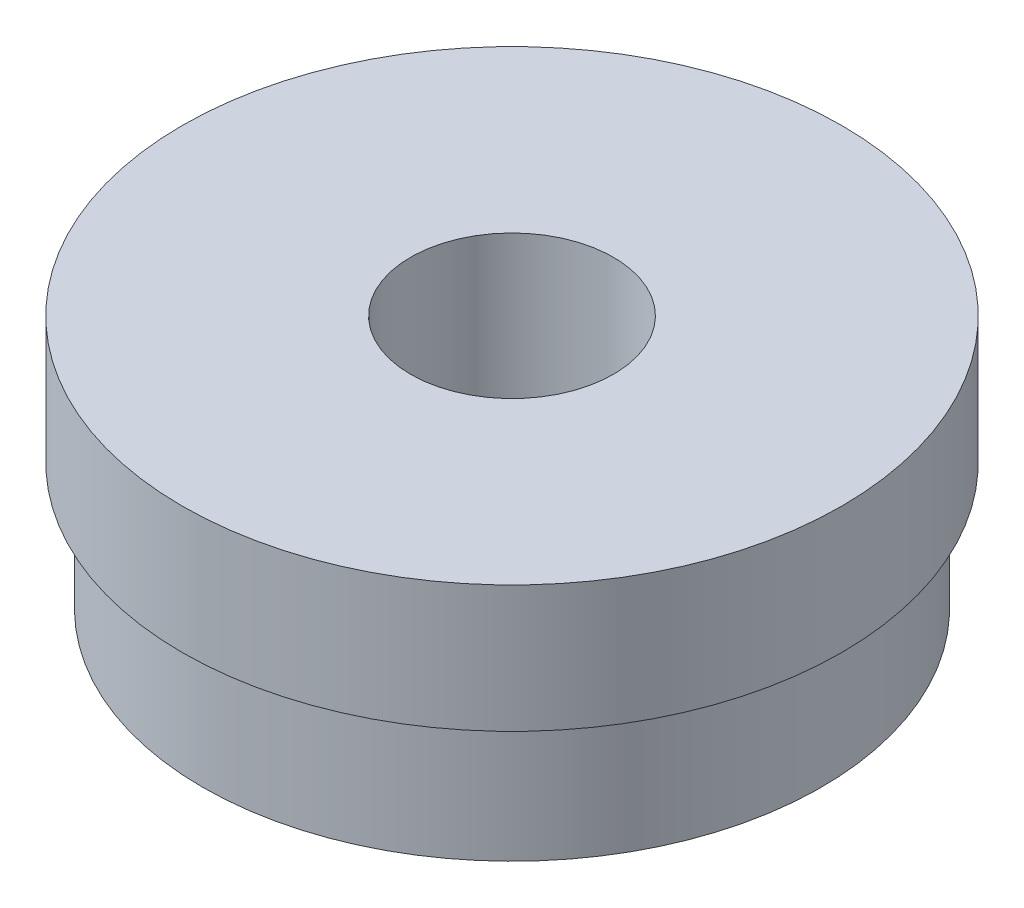
ISO-10303-21;
HEADER;
FILE_DESCRIPTION(('STEP AP214'),'2;1');
FILE_NAME('part.step','',(''),(''),'','','');
FILE_SCHEMA(('AUTOMOTIVE_DESIGN { 1 0 10303 214 1 1 1 1 }'));
ENDSEC;
DATA;
#1=APPLICATION_CONTEXT('core data for automotive mechanical design processes');
#2=APPLICATION_PROTOCOL_DEFINITION('international standard','automotive_design',2000,#1);
#3=PRODUCT_CONTEXT('',#1,'mechanical');
#4=PRODUCT('Part','Part','',(#3));
#5=PRODUCT_RELATED_PRODUCT_CATEGORY('part','',(#4));
#6=PRODUCT_DEFINITION_FORMATION('','',#4);
#7=PRODUCT_DEFINITION_CONTEXT('part definition',#1,'design');
#8=PRODUCT_DEFINITION('design','',#6,#7);
#9=PRODUCT_DEFINITION_SHAPE('','',#8);
#10=(LENGTH_UNIT() NAMED_UNIT(*) SI_UNIT(.MILLI.,.METRE.));
#11=(NAMED_UNIT(*) PLANE_ANGLE_UNIT() SI_UNIT($,.RADIAN.));
#12=(NAMED_UNIT(*) SI_UNIT($,.STERADIAN.) SOLID_ANGLE_UNIT());
#13=UNCERTAINTY_MEASURE_WITH_UNIT(LENGTH_MEASURE(1.E-05),#10,'distance_accuracy_value','');
#14=(GEOMETRIC_REPRESENTATION_CONTEXT(3) GLOBAL_UNCERTAINTY_ASSIGNED_CONTEXT((#13)) GLOBAL_UNIT_ASSIGNED_CONTEXT((#10,
#11,#12)) REPRESENTATION_CONTEXT('',''));
#15=CARTESIAN_POINT('',(0.,0.,0.));
#16=DIRECTION('',(0.,0.,1.));
#17=DIRECTION('',(1.,0.,0.));
#18=AXIS2_PLACEMENT_3D('',#15,#16,#17);
#19=CARTESIAN_POINT('',(0.,48.0535714285714,0.));
#20=DIRECTION('',(0.,-1.,0.));
#21=DIRECTION('',(0.,0.,-1.));
#22=AXIS2_PLACEMENT_3D('',#19,#20,#21);
#23=PLANE('',#22);
#24=CARTESIAN_POINT('',(0.,48.0535714285714,0.));
#25=DIRECTION('',(0.,1.,0.));
#26=DIRECTION('',(0.,0.,1.));
#27=AXIS2_PLACEMENT_3D('',#24,#25,#26);
#28=CIRCLE('',#27,20.);
#29=CARTESIAN_POINT('',(0.,48.0535714285714,20.));
#30=VERTEX_POINT('',#29);
#31=EDGE_CURVE('E60',#30,#30,#28,.T.);
#32=ORIENTED_EDGE('',*,*,#31,.F.);
#33=EDGE_LOOP('',(#32));
#34=FACE_BOUND('',#33,.T.);
#35=CARTESIAN_POINT('',(0.,48.0535714285714,0.));
#36=DIRECTION('',(0.,1.,0.));
#37=DIRECTION('',(0.,0.,1.));
#38=AXIS2_PLACEMENT_3D('',#35,#36,#37);
#39=CIRCLE('',#38,65.);
#40=CARTESIAN_POINT('',(0.,48.0535714285714,65.));
#41=VERTEX_POINT('',#40);
#42=EDGE_CURVE('E10',#41,#41,#39,.T.);
#43=ORIENTED_EDGE('',*,*,#42,.T.);
#44=EDGE_LOOP('',(#43));
#45=FACE_BOUND('',#44,.T.);
#46=ADVANCED_FACE('F36',(#34,#45),#23,.F.);
#47=CARTESIAN_POINT('',(0.,53.1607142857143,0.));
#48=DIRECTION('',(0.,1.,0.));
#49=DIRECTION('',(0.,0.,1.));
#50=AXIS2_PLACEMENT_3D('',#47,#48,#49);
#51=CYLINDRICAL_SURFACE('',#50,65.);
#52=ORIENTED_EDGE('',*,*,#42,.F.);
#53=EDGE_LOOP('',(#52));
#54=FACE_BOUND('',#53,.T.);
#55=CARTESIAN_POINT('',(0.,23.0535714285714,0.));
#56=DIRECTION('',(0.,1.,0.));
#57=DIRECTION('',(0.,0.,1.));
#58=AXIS2_PLACEMENT_3D('',#55,#56,#57);
#59=CIRCLE('',#58,65.);
#60=CARTESIAN_POINT('',(0.,23.0535714285714,65.));
#61=VERTEX_POINT('',#60);
#62=EDGE_CURVE('E43',#61,#61,#59,.T.);
#63=ORIENTED_EDGE('',*,*,#62,.T.);
#64=EDGE_LOOP('',(#63));
#65=FACE_BOUND('',#64,.T.);
#66=ADVANCED_FACE('F78',(#54,#65),#51,.T.);
#67=CARTESIAN_POINT('',(65.,23.0535714285714,0.));
#68=DIRECTION('',(0.,1.,0.));
#69=DIRECTION('',(0.,0.,1.));
#70=AXIS2_PLACEMENT_3D('',#67,#68,#69);
#71=PLANE('',#70);
#72=ORIENTED_EDGE('',*,*,#62,.F.);
#73=EDGE_LOOP('',(#72));
#74=FACE_BOUND('',#73,.T.);
#75=CARTESIAN_POINT('',(0.,23.0535714285714,0.));
#76=DIRECTION('',(0.,1.,0.));
#77=DIRECTION('',(0.,0.,1.));
#78=AXIS2_PLACEMENT_3D('',#75,#76,#77);
#79=CIRCLE('',#78,61.);
#80=CARTESIAN_POINT('',(0.,23.0535714285714,61.));
#81=VERTEX_POINT('',#80);
#82=EDGE_CURVE('E48',#81,#81,#79,.T.);
#83=ORIENTED_EDGE('',*,*,#82,.T.);
#84=EDGE_LOOP('',(#83));
#85=FACE_BOUND('',#84,.T.);
#86=ADVANCED_FACE('F82',(#74,#85),#71,.F.);
#87=CARTESIAN_POINT('',(0.,53.1607142857143,0.));
#88=DIRECTION('',(0.,1.,0.));
#89=DIRECTION('',(0.,0.,1.));
#90=AXIS2_PLACEMENT_3D('',#87,#88,#89);
#91=CYLINDRICAL_SURFACE('',#90,61.);
#92=ORIENTED_EDGE('',*,*,#82,.F.);
#93=EDGE_LOOP('',(#92));
#94=FACE_BOUND('',#93,.T.);
#95=CARTESIAN_POINT('',(0.,-1.94642857142858,0.));
#96=DIRECTION('',(0.,1.,0.));
#97=DIRECTION('',(0.,0.,1.));
#98=AXIS2_PLACEMENT_3D('',#95,#96,#97);
#99=CIRCLE('',#98,61.);
#100=CARTESIAN_POINT('',(0.,-1.94642857142858,61.));
#101=VERTEX_POINT('',#100);
#102=EDGE_CURVE('E53',#101,#101,#99,.T.);
#103=ORIENTED_EDGE('',*,*,#102,.T.);
#104=EDGE_LOOP('',(#103));
#105=FACE_BOUND('',#104,.T.);
#106=ADVANCED_FACE('F87',(#94,#105),#91,.T.);
#107=CARTESIAN_POINT('',(61.,-1.94642857142858,0.));
#108=DIRECTION('',(0.,1.,0.));
#109=DIRECTION('',(0.,0.,1.));
#110=AXIS2_PLACEMENT_3D('',#107,#108,#109);
#111=PLANE('',#110);
#112=CARTESIAN_POINT('',(0.,-1.94642857142858,0.));
#113=DIRECTION('',(0.,1.,0.));
#114=DIRECTION('',(0.,0.,1.));
#115=AXIS2_PLACEMENT_3D('',#112,#113,#114);
#116=CIRCLE('',#115,20.);
#117=CARTESIAN_POINT('',(0.,-1.94642857142858,20.));
#118=VERTEX_POINT('',#117);
#119=EDGE_CURVE('E59',#118,#118,#116,.T.);
#120=ORIENTED_EDGE('',*,*,#119,.T.);
#121=EDGE_LOOP('',(#120));
#122=FACE_BOUND('',#121,.T.);
#123=ORIENTED_EDGE('',*,*,#102,.F.);
#124=EDGE_LOOP('',(#123));
#125=FACE_BOUND('',#124,.T.);
#126=ADVANCED_FACE('F68',(#122,#125),#111,.F.);
#127=CARTESIAN_POINT('',(0.,-1.94642857142858,0.));
#128=DIRECTION('',(0.,1.,0.));
#129=DIRECTION('',(0.,0.,1.));
#130=AXIS2_PLACEMENT_3D('',#127,#128,#129);
#131=CYLINDRICAL_SURFACE('',#130,20.);
#132=ORIENTED_EDGE('',*,*,#119,.F.);
#133=EDGE_LOOP('',(#132));
#134=FACE_BOUND('',#133,.T.);
#135=ORIENTED_EDGE('',*,*,#31,.T.);
#136=EDGE_LOOP('',(#135));
#137=FACE_BOUND('',#136,.T.);
#138=ADVANCED_FACE('F71',(#134,#137),#131,.F.);
#139=CLOSED_SHELL('',(#46,#66,#86,#106,#126,#138));
#140=MANIFOLD_SOLID_BREP('B2',#139);
#141=ADVANCED_BREP_SHAPE_REPRESENTATION('',(#18,#140),#14);
#142=SHAPE_DEFINITION_REPRESENTATION(#9,#141);
ENDSEC;
END-ISO-10303-21;
